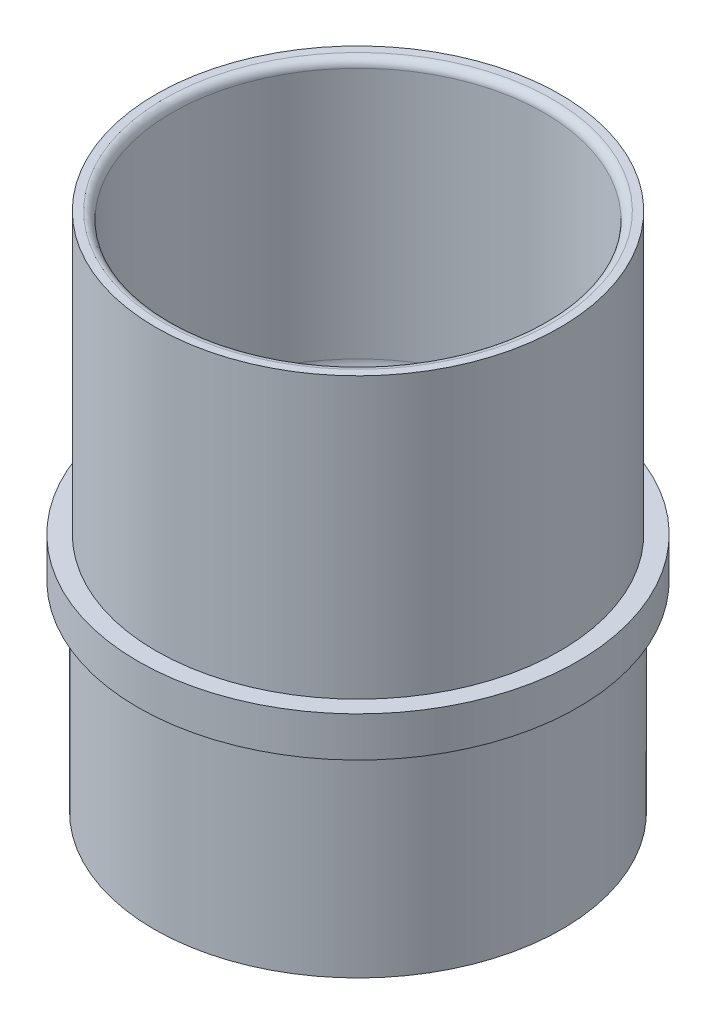
ISO-10303-21;
HEADER;
FILE_DESCRIPTION(('STEP AP214'),'2;1');
FILE_NAME('part.step','',(''),(''),'','','');
FILE_SCHEMA(('AUTOMOTIVE_DESIGN { 1 0 10303 214 1 1 1 1 }'));
ENDSEC;
DATA;
#1=APPLICATION_CONTEXT('core data for automotive mechanical design processes');
#2=APPLICATION_PROTOCOL_DEFINITION('international standard','automotive_design',2000,#1);
#3=PRODUCT_CONTEXT('',#1,'mechanical');
#4=PRODUCT('Part','Part','',(#3));
#5=PRODUCT_RELATED_PRODUCT_CATEGORY('part','',(#4));
#6=PRODUCT_DEFINITION_FORMATION('','',#4);
#7=PRODUCT_DEFINITION_CONTEXT('part definition',#1,'design');
#8=PRODUCT_DEFINITION('design','',#6,#7);
#9=PRODUCT_DEFINITION_SHAPE('','',#8);
#10=(LENGTH_UNIT() NAMED_UNIT(*) SI_UNIT(.MILLI.,.METRE.));
#11=(NAMED_UNIT(*) PLANE_ANGLE_UNIT() SI_UNIT($,.RADIAN.));
#12=(NAMED_UNIT(*) SI_UNIT($,.STERADIAN.) SOLID_ANGLE_UNIT());
#13=UNCERTAINTY_MEASURE_WITH_UNIT(LENGTH_MEASURE(1.E-05),#10,'distance_accuracy_value','');
#14=(GEOMETRIC_REPRESENTATION_CONTEXT(3) GLOBAL_UNCERTAINTY_ASSIGNED_CONTEXT((#13)) GLOBAL_UNIT_ASSIGNED_CONTEXT((#10,
#11,#12)) REPRESENTATION_CONTEXT('',''));
#15=CARTESIAN_POINT('',(0.,0.,0.));
#16=DIRECTION('',(0.,0.,1.));
#17=DIRECTION('',(1.,0.,0.));
#18=AXIS2_PLACEMENT_3D('',#15,#16,#17);
#19=CARTESIAN_POINT('',(0.,0.,0.));
#20=DIRECTION('',(0.,1.,0.));
#21=DIRECTION('',(0.,0.,1.));
#22=AXIS2_PLACEMENT_3D('',#19,#20,#21);
#23=PLANE('',#22);
#24=CARTESIAN_POINT('',(0.,0.,0.));
#25=DIRECTION('',(0.,1.,0.));
#26=DIRECTION('',(0.,0.,1.));
#27=AXIS2_PLACEMENT_3D('',#24,#25,#26);
#28=CIRCLE('',#27,25.5);
#29=CARTESIAN_POINT('',(0.,0.,25.5));
#30=VERTEX_POINT('',#29);
#31=EDGE_CURVE('E58',#30,#30,#28,.T.);
#32=ORIENTED_EDGE('',*,*,#31,.F.);
#33=EDGE_LOOP('',(#32));
#34=FACE_BOUND('',#33,.T.);
#35=CARTESIAN_POINT('',(0.,0.,0.));
#36=DIRECTION('',(0.,1.,0.));
#37=DIRECTION('',(0.,0.,1.));
#38=AXIS2_PLACEMENT_3D('',#35,#36,#37);
#39=CIRCLE('',#38,23.5);
#40=CARTESIAN_POINT('',(0.,0.,23.5));
#41=VERTEX_POINT('',#40);
#42=EDGE_CURVE('E61',#41,#41,#39,.T.);
#43=ORIENTED_EDGE('',*,*,#42,.T.);
#44=EDGE_LOOP('',(#43));
#45=FACE_BOUND('',#44,.T.);
#46=ADVANCED_FACE('F37',(#34,#45),#23,.F.);
#47=CARTESIAN_POINT('',(0.,25.,0.));
#48=DIRECTION('',(0.,-1.,0.));
#49=DIRECTION('',(0.,0.,-1.));
#50=AXIS2_PLACEMENT_3D('',#47,#48,#49);
#51=CYLINDRICAL_SURFACE('',#50,25.5);
#52=CARTESIAN_POINT('',(0.,25.,0.));
#53=DIRECTION('',(0.,1.,0.));
#54=DIRECTION('',(0.,0.,1.));
#55=AXIS2_PLACEMENT_3D('',#52,#53,#54);
#56=CIRCLE('',#55,25.5);
#57=CARTESIAN_POINT('',(0.,25.,25.5));
#58=VERTEX_POINT('',#57);
#59=EDGE_CURVE('E57',#58,#58,#56,.T.);
#60=ORIENTED_EDGE('',*,*,#59,.F.);
#61=EDGE_LOOP('',(#60));
#62=FACE_BOUND('',#61,.T.);
#63=ORIENTED_EDGE('',*,*,#31,.T.);
#64=EDGE_LOOP('',(#63));
#65=FACE_BOUND('',#64,.T.);
#66=ADVANCED_FACE('F117',(#62,#65),#51,.T.);
#67=CARTESIAN_POINT('',(0.,25.,0.));
#68=DIRECTION('',(0.,-1.,0.));
#69=DIRECTION('',(0.,0.,-1.));
#70=AXIS2_PLACEMENT_3D('',#67,#68,#69);
#71=CYLINDRICAL_SURFACE('',#70,23.5);
#72=CARTESIAN_POINT('',(0.,25.,0.));
#73=DIRECTION('',(0.,1.,0.));
#74=DIRECTION('',(0.,0.,1.));
#75=AXIS2_PLACEMENT_3D('',#72,#73,#74);
#76=CIRCLE('',#75,23.5);
#77=CARTESIAN_POINT('',(0.,25.,23.5));
#78=VERTEX_POINT('',#77);
#79=EDGE_CURVE('E66',#78,#78,#76,.T.);
#80=ORIENTED_EDGE('',*,*,#79,.T.);
#81=EDGE_LOOP('',(#80));
#82=FACE_BOUND('',#81,.T.);
#83=ORIENTED_EDGE('',*,*,#42,.F.);
#84=EDGE_LOOP('',(#83));
#85=FACE_BOUND('',#84,.T.);
#86=ADVANCED_FACE('F114',(#82,#85),#71,.F.);
#87=CARTESIAN_POINT('',(0.,25.,0.));
#88=DIRECTION('',(0.,1.,0.));
#89=DIRECTION('',(0.,0.,1.));
#90=AXIS2_PLACEMENT_3D('',#87,#88,#89);
#91=PLANE('',#90);
#92=ORIENTED_EDGE('',*,*,#79,.F.);
#93=EDGE_LOOP('',(#92));
#94=FACE_BOUND('',#93,.T.);
#95=ADVANCED_FACE('F102',(#94),#91,.F.);
#96=CARTESIAN_POINT('',(0.,30.,0.));
#97=DIRECTION('',(0.,-1.,0.));
#98=DIRECTION('',(0.,0.,-1.));
#99=AXIS2_PLACEMENT_3D('',#96,#97,#98);
#100=CYLINDRICAL_SURFACE('',#99,27.5);
#101=CARTESIAN_POINT('',(0.,30.,0.));
#102=DIRECTION('',(0.,1.,0.));
#103=DIRECTION('',(0.,0.,1.));
#104=AXIS2_PLACEMENT_3D('',#101,#102,#103);
#105=CIRCLE('',#104,27.5);
#106=CARTESIAN_POINT('',(0.,30.,27.5));
#107=VERTEX_POINT('',#106);
#108=EDGE_CURVE('E69',#107,#107,#105,.T.);
#109=ORIENTED_EDGE('',*,*,#108,.F.);
#110=EDGE_LOOP('',(#109));
#111=FACE_BOUND('',#110,.T.);
#112=CARTESIAN_POINT('',(0.,25.,0.));
#113=DIRECTION('',(0.,1.,0.));
#114=DIRECTION('',(0.,0.,1.));
#115=AXIS2_PLACEMENT_3D('',#112,#113,#114);
#116=CIRCLE('',#115,27.5);
#117=CARTESIAN_POINT('',(0.,25.,27.5));
#118=VERTEX_POINT('',#117);
#119=EDGE_CURVE('E70',#118,#118,#116,.T.);
#120=ORIENTED_EDGE('',*,*,#119,.T.);
#121=EDGE_LOOP('',(#120));
#122=FACE_BOUND('',#121,.T.);
#123=ADVANCED_FACE('F95',(#111,#122),#100,.T.);
#124=CARTESIAN_POINT('',(0.,30.,0.));
#125=DIRECTION('',(0.,1.,0.));
#126=DIRECTION('',(0.,0.,1.));
#127=AXIS2_PLACEMENT_3D('',#124,#125,#126);
#128=PLANE('',#127);
#129=CARTESIAN_POINT('',(0.,30.,0.));
#130=DIRECTION('',(0.,1.,0.));
#131=DIRECTION('',(0.,0.,1.));
#132=AXIS2_PLACEMENT_3D('',#129,#130,#131);
#133=CIRCLE('',#132,25.25);
#134=CARTESIAN_POINT('',(0.,30.,25.25));
#135=VERTEX_POINT('',#134);
#136=EDGE_CURVE('E76',#135,#135,#133,.T.);
#137=ORIENTED_EDGE('',*,*,#136,.F.);
#138=EDGE_LOOP('',(#137));
#139=FACE_BOUND('',#138,.T.);
#140=ORIENTED_EDGE('',*,*,#108,.T.);
#141=EDGE_LOOP('',(#140));
#142=FACE_BOUND('',#141,.T.);
#143=ADVANCED_FACE('F91',(#139,#142),#128,.T.);
#144=ORIENTED_EDGE('',*,*,#59,.T.);
#145=EDGE_LOOP('',(#144));
#146=FACE_BOUND('',#145,.T.);
#147=ORIENTED_EDGE('',*,*,#119,.F.);
#148=EDGE_LOOP('',(#147));
#149=FACE_BOUND('',#148,.T.);
#150=ADVANCED_FACE('F94',(#146,#149),#91,.F.);
#151=CARTESIAN_POINT('',(0.,65.,0.));
#152=DIRECTION('',(0.,1.,0.));
#153=DIRECTION('',(0.,0.,1.));
#154=AXIS2_PLACEMENT_3D('',#151,#152,#153);
#155=PLANE('',#154);
#156=CARTESIAN_POINT('',(0.,65.,0.));
#157=DIRECTION('',(0.,1.,0.));
#158=DIRECTION('',(0.,0.,1.));
#159=AXIS2_PLACEMENT_3D('',#156,#157,#158);
#160=CIRCLE('',#159,24.25);
#161=CARTESIAN_POINT('',(0.,65.,24.25));
#162=VERTEX_POINT('',#161);
#163=EDGE_CURVE('E10',#162,#162,#160,.F.);
#164=ORIENTED_EDGE('',*,*,#163,.T.);
#165=EDGE_LOOP('',(#164));
#166=FACE_BOUND('',#165,.T.);
#167=CARTESIAN_POINT('',(0.,65.,0.));
#168=DIRECTION('',(0.,1.,0.));
#169=DIRECTION('',(0.,0.,1.));
#170=AXIS2_PLACEMENT_3D('',#167,#168,#169);
#171=CIRCLE('',#170,25.25);
#172=CARTESIAN_POINT('',(0.,65.,25.25));
#173=VERTEX_POINT('',#172);
#174=EDGE_CURVE('E73',#173,#173,#171,.T.);
#175=ORIENTED_EDGE('',*,*,#174,.T.);
#176=EDGE_LOOP('',(#175));
#177=FACE_BOUND('',#176,.T.);
#178=ADVANCED_FACE('F82',(#166,#177),#155,.T.);
#179=CARTESIAN_POINT('',(0.,65.,0.));
#180=DIRECTION('',(0.,-1.,0.));
#181=DIRECTION('',(0.,0.,-1.));
#182=AXIS2_PLACEMENT_3D('',#179,#180,#181);
#183=CYLINDRICAL_SURFACE('',#182,25.25);
#184=ORIENTED_EDGE('',*,*,#174,.F.);
#185=EDGE_LOOP('',(#184));
#186=FACE_BOUND('',#185,.T.);
#187=ORIENTED_EDGE('',*,*,#136,.T.);
#188=EDGE_LOOP('',(#187));
#189=FACE_BOUND('',#188,.T.);
#190=ADVANCED_FACE('F84',(#186,#189),#183,.T.);
#191=CARTESIAN_POINT('',(0.,65.,0.));
#192=DIRECTION('',(0.,-1.,0.));
#193=DIRECTION('',(0.,0.,-1.));
#194=AXIS2_PLACEMENT_3D('',#191,#192,#193);
#195=CYLINDRICAL_SURFACE('',#194,23.25);
#196=CARTESIAN_POINT('',(0.,64.,0.));
#197=DIRECTION('',(0.,1.,0.));
#198=DIRECTION('',(0.,0.,1.));
#199=AXIS2_PLACEMENT_3D('',#196,#197,#198);
#200=CIRCLE('',#199,23.25);
#201=CARTESIAN_POINT('',(0.,64.,23.25));
#202=VERTEX_POINT('',#201);
#203=EDGE_CURVE('E44',#202,#202,#200,.T.);
#204=ORIENTED_EDGE('',*,*,#203,.T.);
#205=EDGE_LOOP('',(#204));
#206=FACE_BOUND('',#205,.T.);
#207=CARTESIAN_POINT('',(0.,32.54,0.));
#208=DIRECTION('',(0.,1.,0.));
#209=DIRECTION('',(0.,0.,1.));
#210=AXIS2_PLACEMENT_3D('',#207,#208,#209);
#211=CIRCLE('',#210,23.25);
#212=CARTESIAN_POINT('',(0.,32.54,23.25));
#213=VERTEX_POINT('',#212);
#214=EDGE_CURVE('E52',#213,#213,#211,.F.);
#215=ORIENTED_EDGE('',*,*,#214,.T.);
#216=EDGE_LOOP('',(#215));
#217=FACE_BOUND('',#216,.T.);
#218=ADVANCED_FACE('F87',(#206,#217),#195,.F.);
#219=CARTESIAN_POINT('',(0.,30.,0.));
#220=DIRECTION('',(0.,1.,0.));
#221=DIRECTION('',(0.,0.,1.));
#222=AXIS2_PLACEMENT_3D('',#219,#220,#221);
#223=CIRCLE('',#222,20.71);
#224=CARTESIAN_POINT('',(0.,30.,20.71));
#225=VERTEX_POINT('',#224);
#226=EDGE_CURVE('E48',#225,#225,#223,.T.);
#227=ORIENTED_EDGE('',*,*,#226,.T.);
#228=EDGE_LOOP('',(#227));
#229=FACE_BOUND('',#228,.T.);
#230=ADVANCED_FACE('F97',(#229),#128,.T.);
#231=CARTESIAN_POINT('',(0.,32.54,0.));
#232=DIRECTION('',(0.,1.,0.));
#233=DIRECTION('',(0.,0.,1.));
#234=AXIS2_PLACEMENT_3D('',#231,#232,#233);
#235=TOROIDAL_SURFACE('',#234,20.71,2.54);
#236=ORIENTED_EDGE('',*,*,#226,.F.);
#237=EDGE_LOOP('',(#236));
#238=FACE_BOUND('',#237,.T.);
#239=ORIENTED_EDGE('',*,*,#214,.F.);
#240=EDGE_LOOP('',(#239));
#241=FACE_BOUND('',#240,.T.);
#242=ADVANCED_FACE('F128',(#238,#241),#235,.F.);
#243=CARTESIAN_POINT('',(0.,64.,0.));
#244=DIRECTION('',(0.,1.,0.));
#245=DIRECTION('',(0.,0.,1.));
#246=AXIS2_PLACEMENT_3D('',#243,#244,#245);
#247=TOROIDAL_SURFACE('',#246,24.25,1.);
#248=ORIENTED_EDGE('',*,*,#163,.F.);
#249=EDGE_LOOP('',(#248));
#250=FACE_BOUND('',#249,.T.);
#251=ORIENTED_EDGE('',*,*,#203,.F.);
#252=EDGE_LOOP('',(#251));
#253=FACE_BOUND('',#252,.T.);
#254=ADVANCED_FACE('F39',(#250,#253),#247,.T.);
#255=CLOSED_SHELL('',(#46,#66,#86,#95,#123,#143,#150,#178,#190,#218,#230,#242,#254));
#256=MANIFOLD_SOLID_BREP('B2',#255);
#257=ADVANCED_BREP_SHAPE_REPRESENTATION('',(#18,#256),#14);
#258=SHAPE_DEFINITION_REPRESENTATION(#9,#257);
ENDSEC;
END-ISO-10303-21;
